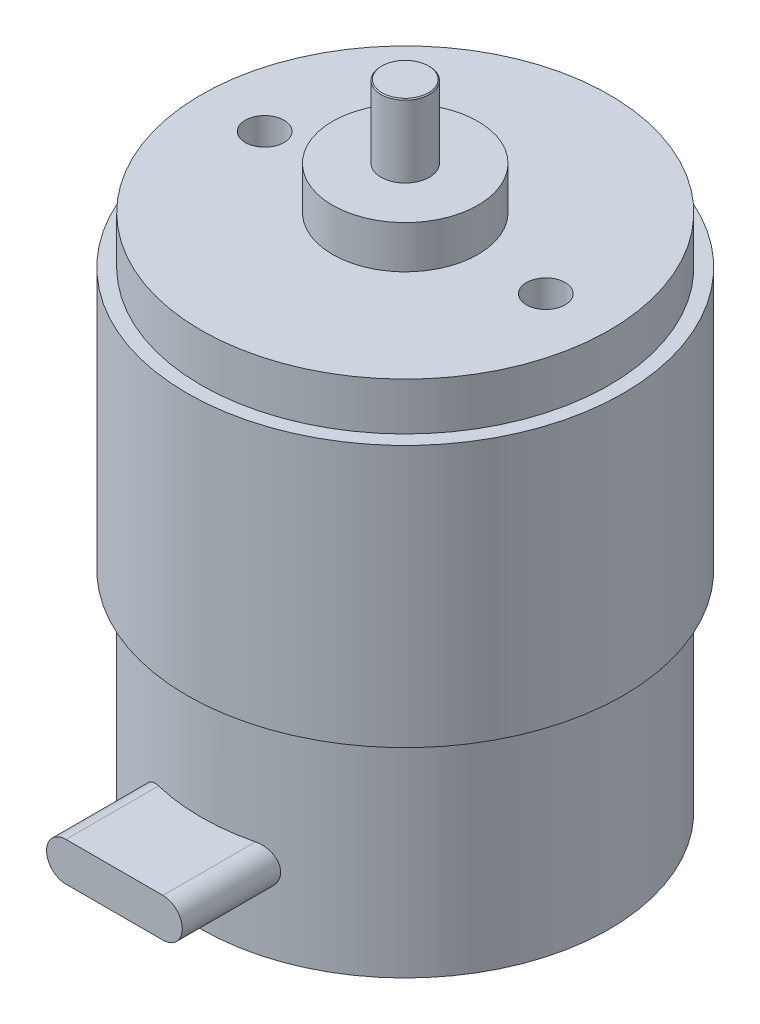
ISO-10303-21;
HEADER;
FILE_DESCRIPTION(('STEP AP214'),'2;1');
FILE_NAME('part.step','',(''),(''),'','','');
FILE_SCHEMA(('AUTOMOTIVE_DESIGN { 1 0 10303 214 1 1 1 1 }'));
ENDSEC;
DATA;
#1=APPLICATION_CONTEXT('core data for automotive mechanical design processes');
#2=APPLICATION_PROTOCOL_DEFINITION('international standard','automotive_design',2000,#1);
#3=PRODUCT_CONTEXT('',#1,'mechanical');
#4=PRODUCT('Part','Part','',(#3));
#5=PRODUCT_RELATED_PRODUCT_CATEGORY('part','',(#4));
#6=PRODUCT_DEFINITION_FORMATION('','',#4);
#7=PRODUCT_DEFINITION_CONTEXT('part definition',#1,'design');
#8=PRODUCT_DEFINITION('design','',#6,#7);
#9=PRODUCT_DEFINITION_SHAPE('','',#8);
#10=(LENGTH_UNIT() NAMED_UNIT(*) SI_UNIT(.MILLI.,.METRE.));
#11=(NAMED_UNIT(*) PLANE_ANGLE_UNIT() SI_UNIT($,.RADIAN.));
#12=(NAMED_UNIT(*) SI_UNIT($,.STERADIAN.) SOLID_ANGLE_UNIT());
#13=UNCERTAINTY_MEASURE_WITH_UNIT(LENGTH_MEASURE(1.E-05),#10,'distance_accuracy_value','');
#14=(GEOMETRIC_REPRESENTATION_CONTEXT(3) GLOBAL_UNCERTAINTY_ASSIGNED_CONTEXT((#13)) GLOBAL_UNIT_ASSIGNED_CONTEXT((#10,
#11,#12)) REPRESENTATION_CONTEXT('',''));
#15=CARTESIAN_POINT('',(0.,0.,0.));
#16=DIRECTION('',(0.,0.,1.));
#17=DIRECTION('',(1.,0.,0.));
#18=AXIS2_PLACEMENT_3D('',#15,#16,#17);
#19=CARTESIAN_POINT('',(0.,57.8,0.));
#20=DIRECTION('',(0.,-1.,0.));
#21=DIRECTION('',(0.,0.,-1.));
#22=AXIS2_PLACEMENT_3D('',#19,#20,#21);
#23=CYLINDRICAL_SURFACE('',#22,21.05);
#24=CARTESIAN_POINT('',(0.,25.9,0.));
#25=DIRECTION('',(0.,1.,0.));
#26=DIRECTION('',(0.,0.,1.));
#27=AXIS2_PLACEMENT_3D('',#24,#25,#26);
#28=CIRCLE('',#27,21.05);
#29=CARTESIAN_POINT('',(0.,25.9,21.05));
#30=VERTEX_POINT('',#29);
#31=EDGE_CURVE('E138',#30,#30,#28,.T.);
#32=ORIENTED_EDGE('',*,*,#31,.F.);
#33=EDGE_LOOP('',(#32));
#34=FACE_BOUND('',#33,.T.);
#35=CARTESIAN_POINT('',(0.,4.3,0.));
#36=DIRECTION('',(0.,1.,0.));
#37=DIRECTION('',(0.,0.,1.));
#38=AXIS2_PLACEMENT_3D('',#35,#36,#37);
#39=CIRCLE('',#38,21.05);
#40=CARTESIAN_POINT('',(0.,4.3,21.05));
#41=VERTEX_POINT('',#40);
#42=EDGE_CURVE('E125',#41,#41,#39,.T.);
#43=ORIENTED_EDGE('',*,*,#42,.T.);
#44=EDGE_LOOP('',(#43));
#45=FACE_BOUND('',#44,.T.);
#46=CARTESIAN_POINT('',(-7.,12.3,19.8520150110763));
#47=CARTESIAN_POINT('',(-6.99999458740722,12.1919907328869,19.8520177212447));
#48=CARTESIAN_POINT('',(-6.99121278584679,12.0839058525315,19.8551202290441));
#49=CARTESIAN_POINT('',(-6.95639774985022,11.8708259013393,19.8673439481557));
#50=CARTESIAN_POINT('',(-6.93034452504061,11.7658345582844,19.8764721336847));
#51=CARTESIAN_POINT('',(-6.86201484465957,11.5621550404507,19.9001645147042));
#52=CARTESIAN_POINT('',(-6.81976886088892,11.4634554302279,19.9147184984386));
#53=CARTESIAN_POINT('',(-6.72050187146198,11.2746951825582,19.9484357733604));
#54=CARTESIAN_POINT('',(-6.66348208410157,11.1846338336108,19.9675986844714));
#55=CARTESIAN_POINT('',(-6.53460276230515,11.0128128894359,20.0101521180577));
#56=CARTESIAN_POINT('',(-6.46236912491593,10.9313601377524,20.0336468816873));
#57=CARTESIAN_POINT('',(-6.30618309033368,10.7815793095357,20.0833579208581));
#58=CARTESIAN_POINT('',(-6.22222773333387,10.7132545582903,20.1095748833416));
#59=CARTESIAN_POINT('',(-6.04028832514777,10.5881017346661,20.1649917831418));
#60=CARTESIAN_POINT('',(-5.94180988005296,10.5320286621991,20.1942755040172));
#61=CARTESIAN_POINT('',(-5.73695639275948,10.4373042085942,20.2534242865081));
#62=CARTESIAN_POINT('',(-5.63057987302569,10.3986560968498,20.2832894561235));
#63=CARTESIAN_POINT('',(-5.40963160151527,10.3389651179522,20.3433488469252));
#64=CARTESIAN_POINT('',(-5.29491359897331,10.3184471248896,20.3735287565104));
#65=CARTESIAN_POINT('',(-5.0632572428235,10.2976209419156,20.432332303052));
#66=CARTESIAN_POINT('',(-4.94631891147026,10.297312549548,20.4609559555959));
#67=CARTESIAN_POINT('',(-4.71424469821783,10.3171155515014,20.5156655639204));
#68=CARTESIAN_POINT('',(-4.59910247310299,10.3371159283911,20.5417644714698));
#69=CARTESIAN_POINT('',(-4.37347049514689,10.3970861337864,20.5909832404264));
#70=CARTESIAN_POINT('',(-4.26298011512261,10.4370532608746,20.6141035042994));
#71=CARTESIAN_POINT('',(-4.05281498277954,10.5347981412374,20.6564375418517));
#72=CARTESIAN_POINT('',(-3.95293982410393,10.592109109256,20.6757340463452));
#73=CARTESIAN_POINT('',(-3.76411357706212,10.7233582256204,20.710943602515));
#74=CARTESIAN_POINT('',(-3.67516103074906,10.7972941511339,20.726857105961));
#75=CARTESIAN_POINT('',(-3.51300272184728,10.9577833153158,20.7549498073808));
#76=CARTESIAN_POINT('',(-3.43947438845406,11.0439969226404,20.7672083982979));
#77=CARTESIAN_POINT('',(-3.30787625785314,11.2278552765582,20.7885765091082));
#78=CARTESIAN_POINT('',(-3.24980526432342,11.3254991376633,20.7976862727215));
#79=CARTESIAN_POINT('',(-3.1516120824661,11.5280172105594,20.8127914470683));
#80=CARTESIAN_POINT('',(-3.11125923923933,11.6327766612723,20.8188270538593));
#81=CARTESIAN_POINT('',(-3.04860765544321,11.8476798007039,20.8280940791415));
#82=CARTESIAN_POINT('',(-3.02630831712851,11.9578233110302,20.8313255904755));
#83=CARTESIAN_POINT('',(-3.00051106814381,12.1797524979786,20.8350571187568));
#84=CARTESIAN_POINT('',(-2.99691594866212,12.2915266503951,20.8355712585399));
#85=CARTESIAN_POINT('',(-3.00837255069223,12.5140944249423,20.8339200997523));
#86=CARTESIAN_POINT('',(-3.02342402903209,12.624888059841,20.8317548361239));
#87=CARTESIAN_POINT('',(-3.07169374525748,12.8422306267945,20.8246917157905));
#88=CARTESIAN_POINT('',(-3.10489292003565,12.9487838873351,20.8197967263962));
#89=CARTESIAN_POINT('',(-3.18844192353917,13.154756407484,20.8071649278569));
#90=CARTESIAN_POINT('',(-3.23879164195814,13.2541757129703,20.7994281369894));
#91=CARTESIAN_POINT('',(-3.3552201672281,13.4432618856871,20.7809639754251));
#92=CARTESIAN_POINT('',(-3.42132610098154,13.5329115406292,20.7702314415533));
#93=CARTESIAN_POINT('',(-3.56721608206618,13.6997908384376,20.7456724769296));
#94=CARTESIAN_POINT('',(-3.64700028942627,13.7770203359737,20.7318460099795));
#95=CARTESIAN_POINT('',(-3.81841123420319,13.9174685996667,20.7009626191932));
#96=CARTESIAN_POINT('',(-3.91011192362275,13.9805925515289,20.6838851837346));
#97=CARTESIAN_POINT('',(-4.10221024774402,14.090594111553,20.6466446147876));
#98=CARTESIAN_POINT('',(-4.20260839533094,14.1374707608027,20.6264812992725));
#99=CARTESIAN_POINT('',(-4.4107808777925,14.2145038527736,20.5829778996621));
#100=CARTESIAN_POINT('',(-4.51864431583639,14.2443945571535,20.5595940797648));
#101=CARTESIAN_POINT('',(-4.73728285009642,14.2857906317402,20.510319632099));
#102=CARTESIAN_POINT('',(-4.84805831842685,14.2972936405497,20.4844286828108));
#103=CARTESIAN_POINT('',(-5.07223167907004,14.3019129797533,20.4300901808977));
#104=CARTESIAN_POINT('',(-5.18562754812686,14.2945734246514,20.4015956341564));
#105=CARTESIAN_POINT('',(-5.4092703561476,14.2609412681865,20.3434425717603));
#106=CARTESIAN_POINT('',(-5.51951679174363,14.2346456545381,20.3137838718196));
#107=CARTESIAN_POINT('',(-5.736499222247,14.1630419019824,20.2535935446595));
#108=CARTESIAN_POINT('',(-5.84309137726478,14.1173005484936,20.2230578103611));
#109=CARTESIAN_POINT('',(-6.04702161801546,14.0079615503035,20.1630191588543));
#110=CARTESIAN_POINT('',(-6.14435915708079,13.9443628516499,20.1335163027226));
#111=CARTESIAN_POINT('',(-6.32718945268471,13.8007043228696,20.0768116662611));
#112=CARTESIAN_POINT('',(-6.41265536845018,13.7206081759781,20.0496151527246));
#113=CARTESIAN_POINT('',(-6.56879789461983,13.5460257394711,19.9990036896438));
#114=CARTESIAN_POINT('',(-6.63947350732978,13.4515384798314,19.9755889952301));
#115=CARTESIAN_POINT('',(-6.76148165429124,13.2540536691967,19.9346152675769));
#116=CARTESIAN_POINT('',(-6.81336951746675,13.151433827404,19.9168902663545));
#117=CARTESIAN_POINT('',(-6.89892043382572,12.9381645879723,19.8874198545959));
#118=CARTESIAN_POINT('',(-6.93261324368046,12.8275286383053,19.8756646827311));
#119=CARTESIAN_POINT('',(-6.9709579638666,12.6466628353925,19.8622370389649));
#120=CARTESIAN_POINT('',(-6.9818297273083,12.577847891094,19.8584141596332));
#121=CARTESIAN_POINT('',(-6.99635236484358,12.4393657733328,19.8533023157847));
#122=CARTESIAN_POINT('',(-7.00000349275864,12.3696986299134,19.8520132621984));
#123=CARTESIAN_POINT('',(-7.,12.3,19.8520150110763));
#124=B_SPLINE_CURVE_WITH_KNOTS('',3,(#46,#47,#48,#49,#50,#51,#52,#53,#54,#55,#56,#57,#58,#59,
#60,#61,#62,#63,#64,#65,#66,#67,#68,#69,#70,#71,#72,#73,#74,#75,#76,#77,#78,#79,#80,#81,#82,#83,
#84,#85,#86,#87,#88,#89,#90,#91,#92,#93,#94,#95,#96,#97,#98,#99,#100,#101,#102,#103,#104,#105,
#106,#107,#108,#109,#110,#111,#112,#113,#114,#115,#116,#117,#118,#119,#120,#121,#122,#123),
.UNSPECIFIED.,.T.,.F.,(4,2,2,2,2,2,2,2,2,2,2,2,2,2,2,2,2,2,2,2,2,2,2,2,2,2,2,2,2,2,2,2,2,2,2,2,
2,2,4),(0.,0.323764536264168,0.647904461417779,0.971437385865336,1.29494363922239,
1.62759967888818,1.96033986869083,2.30988655661203,2.6594988016731,3.0189289596355,
3.37835551688897,3.73582779858486,4.09325172887544,4.44180251087894,4.79030671774284,
5.13057144167921,5.47080982313888,5.80647721673889,6.14213349605224,6.47604356083769,
6.80994927111818,7.14350490487384,7.47705839335529,7.81119035048683,8.14532621706029,
8.48164468235117,8.81798299370817,9.1594477483614,9.50095635131267,9.85080501150902,
10.2007092780074,10.5588548377817,10.9170215399877,11.2759852870953,11.6349732406512,
11.9822617003633,12.328980461957,12.5379138107405,12.7468398149188),.UNSPECIFIED.);
#125=CARTESIAN_POINT('',(-5.,14.3,20.4475548660469));
#126=VERTEX_POINT('',#125);
#127=CARTESIAN_POINT('',(-5.,10.3,20.4475548660469));
#128=VERTEX_POINT('',#127);
#129=EDGE_CURVE('E11',#126,#128,#124,.T.);
#130=ORIENTED_EDGE('',*,*,#129,.F.);
#131=CARTESIAN_POINT('',(0.,14.3,0.));
#132=DIRECTION('',(0.,-1.,0.));
#133=DIRECTION('',(0.,0.,-1.));
#134=AXIS2_PLACEMENT_3D('',#131,#132,#133);
#135=CIRCLE('',#134,21.05);
#136=CARTESIAN_POINT('',(5.,14.3,20.4475548660469));
#137=VERTEX_POINT('',#136);
#138=EDGE_CURVE('E160',#137,#126,#135,.T.);
#139=ORIENTED_EDGE('',*,*,#138,.F.);
#140=CARTESIAN_POINT('',(3.,12.3,20.8351265894882));
#141=CARTESIAN_POINT('',(3.00000487464043,12.1886690639383,20.8351266710625));
#142=CARTESIAN_POINT('',(3.0093279873551,12.0772630600193,20.8337900726467));
#143=CARTESIAN_POINT('',(3.04637186078782,11.8575329442028,20.8284050139589));
#144=CARTESIAN_POINT('',(3.07411317680268,11.7492124168159,20.8243535237348));
#145=CARTESIAN_POINT('',(3.14714848005361,11.5388666467158,20.8134406470107));
#146=CARTESIAN_POINT('',(3.19243299832294,11.4368380423075,20.8065807762247));
#147=CARTESIAN_POINT('',(3.29917125660406,11.2419229575568,20.7899223725633));
#148=CARTESIAN_POINT('',(3.36062118407493,11.1490343286795,20.780124532519));
#149=CARTESIAN_POINT('',(3.49799810482074,10.9747331915955,20.7574408921113));
#150=CARTESIAN_POINT('',(3.57395922676533,10.8933485406367,20.7445477933278));
#151=CARTESIAN_POINT('',(3.7379687494048,10.7445122332395,20.7156223617089));
#152=CARTESIAN_POINT('',(3.82601785867696,10.6770613941585,20.6995898448226));
#153=CARTESIAN_POINT('',(4.01243060527973,10.5572743381062,20.6642678833178));
#154=CARTESIAN_POINT('',(4.11088096176998,10.5050815280538,20.6449500778314));
#155=CARTESIAN_POINT('',(4.31452569127696,10.4178740348447,20.6033531931226));
#156=CARTESIAN_POINT('',(4.41972061587774,10.3828607586954,20.5810738715412));
#157=CARTESIAN_POINT('',(4.63589754974514,10.3302192237535,20.5334707997944));
#158=CARTESIAN_POINT('',(4.74695115838219,10.3129299974961,20.5080977101211));
#159=CARTESIAN_POINT('',(4.96988065758192,10.2971056190543,20.4552173347079));
#160=CARTESIAN_POINT('',(5.0817566627455,10.2985731321037,20.4277097462188));
#161=CARTESIAN_POINT('',(5.30623801323099,10.3202877846665,20.3705693257632));
#162=CARTESIAN_POINT('',(5.41878711430894,10.3410206517389,20.3408998903947));
#163=CARTESIAN_POINT('',(5.63861049628856,10.4012714414099,20.2810640956737));
#164=CARTESIAN_POINT('',(5.74588396065884,10.4407922618615,20.2508976603571));
#165=CARTESIAN_POINT('',(5.95423343174509,10.538488841956,20.1906312082022));
#166=CARTESIAN_POINT('',(6.05515617590388,10.5969993893731,20.1605429656359));
#167=CARTESIAN_POINT('',(6.24569623602726,10.7309862190804,20.1023311238028));
#168=CARTESIAN_POINT('',(6.33531332549699,10.8064628411807,20.0742075639011));
#169=CARTESIAN_POINT('',(6.4997077846176,10.9717192049707,20.0215806623204));
#170=CARTESIAN_POINT('',(6.57461777461491,11.0613565774845,19.997045529922));
#171=CARTESIAN_POINT('',(6.70810764703968,11.2530988895776,19.9526629217841));
#172=CARTESIAN_POINT('',(6.76669212998493,11.3552003051106,19.9328141256791));
#173=CARTESIAN_POINT('',(6.86315991916107,11.5642640201775,19.8997998607963));
#174=CARTESIAN_POINT('',(6.90183318728231,11.6708213904202,19.8863811254138));
#175=CARTESIAN_POINT('',(6.9606879024199,11.8895003707626,19.8658579195518));
#176=CARTESIAN_POINT('',(6.98087604879386,12.0016199494704,19.8587511615204));
#177=CARTESIAN_POINT('',(7.00140260692352,12.2222310964672,19.851523129391));
#178=CARTESIAN_POINT('',(7.00267891499864,12.3306255122503,19.8510717978602));
#179=CARTESIAN_POINT('',(6.98774162329109,12.5460402218036,19.8563347305512));
#180=CARTESIAN_POINT('',(6.97153005565029,12.6530606737704,19.862048278396));
#181=CARTESIAN_POINT('',(6.92263594879835,12.8609819168792,19.8791413311265));
#182=CARTESIAN_POINT('',(6.89021713063559,12.9619525904923,19.8904300828742));
#183=CARTESIAN_POINT('',(6.81018259904333,13.1569423504352,19.9179741461397));
#184=CARTESIAN_POINT('',(6.76256510655171,13.2509606213723,19.9342300390705));
#185=CARTESIAN_POINT('',(6.652026500425,13.4324437468915,19.9713927999275));
#186=CARTESIAN_POINT('',(6.58869459655579,13.5196327075642,19.9924229531909));
#187=CARTESIAN_POINT('',(6.44941046846463,13.6822738275325,20.0377883416951));
#188=CARTESIAN_POINT('',(6.37345520646505,13.7577231532334,20.0621243722285));
#189=CARTESIAN_POINT('',(6.20681143528395,13.8987868046329,20.1143228128624));
#190=CARTESIAN_POINT('',(6.11556971019452,13.9637048555831,20.1423016775284));
#191=CARTESIAN_POINT('',(5.92385165268387,14.0773357584262,20.1995169880506));
#192=CARTESIAN_POINT('',(5.8233733144413,14.1260450797738,20.2287537063254));
#193=CARTESIAN_POINT('',(5.61187163203816,14.2075977581526,20.288467175143));
#194=CARTESIAN_POINT('',(5.50059470329945,14.2397812236645,20.3189494865766));
#195=CARTESIAN_POINT('',(5.27390593817923,14.2845211037051,20.3789636776966));
#196=CARTESIAN_POINT('',(5.1584938738254,14.2970764344155,20.4084955048114));
#197=CARTESIAN_POINT('',(4.92627217035169,14.3020253307042,20.4657934069464));
#198=CARTESIAN_POINT('',(4.80945870232305,14.2943342330689,20.4935515684789));
#199=CARTESIAN_POINT('',(4.57837803303966,14.2585452412746,20.5464109245676));
#200=CARTESIAN_POINT('',(4.46411055062329,14.2304496120837,20.5715124136687));
#201=CARTESIAN_POINT('',(4.24405636408111,14.1552040314264,20.6180230805467));
#202=CARTESIAN_POINT('',(4.13814088631952,14.1084725440395,20.6394994981659));
#203=CARTESIAN_POINT('',(3.93549236812381,13.9971103124678,20.6790973569974));
#204=CARTESIAN_POINT('',(3.8387576744026,13.9324827992653,20.6972194028301));
#205=CARTESIAN_POINT('',(3.65993985873888,13.7889743466049,20.72957796124));
#206=CARTESIAN_POINT('',(3.57754373342108,13.7105030423572,20.7439024695082));
#207=CARTESIAN_POINT('',(3.42701676610904,13.540410422449,20.7693018420908));
#208=CARTESIAN_POINT('',(3.35888790770219,13.4487872812606,20.780376254628));
#209=CARTESIAN_POINT('',(3.24005884981857,13.2566437876889,20.7992329574974));
#210=CARTESIAN_POINT('',(3.18909400895441,13.1562917535877,20.8070657079218));
#211=CARTESIAN_POINT('',(3.10470214333042,12.9483853183305,20.8198262017372));
#212=CARTESIAN_POINT('',(3.07125452759334,12.8408395417393,20.824757356714));
#213=CARTESIAN_POINT('',(3.03142941825745,12.6605441109147,20.8305825361783));
#214=CARTESIAN_POINT('',(3.01965973036164,12.5889647594777,20.8322878960173));
#215=CARTESIAN_POINT('',(3.00394344784383,12.4449342098966,20.8345598941596));
#216=CARTESIAN_POINT('',(2.99999682632117,12.3724830147512,20.8351265363786));
#217=CARTESIAN_POINT('',(3.,12.3,20.8351265894882));
#218=B_SPLINE_CURVE_WITH_KNOTS('',3,(#140,#141,#142,#143,#144,#145,#146,#147,#148,#149,#150,
#151,#152,#153,#154,#155,#156,#157,#158,#159,#160,#161,#162,#163,#164,#165,#166,#167,#168,#169,
#170,#171,#172,#173,#174,#175,#176,#177,#178,#179,#180,#181,#182,#183,#184,#185,#186,#187,#188,
#189,#190,#191,#192,#193,#194,#195,#196,#197,#198,#199,#200,#201,#202,#203,#204,#205,#206,#207,
#208,#209,#210,#211,#212,#213,#214,#215,#216,#217),.UNSPECIFIED.,.T.,.F.,(4,2,2,2,2,2,2,2,2,2,2,
2,2,2,2,2,2,2,2,2,2,2,2,2,2,2,2,2,2,2,2,2,2,2,2,2,2,2,4),(0.,0.333728225853083,
0.667829530434417,1.00175075407964,1.33559329436264,1.67023088191007,2.00488809372661,
2.34259638387025,2.68033232777771,3.02441444074544,3.36854544651192,3.72159532674371,
4.07469967904803,4.43440215841308,4.79411184283,5.15041165117607,5.5066109526881,
5.84730834352352,6.18788221025437,6.51150605670392,6.83509230117472,7.15357669334513,
7.47209837899448,7.80003615365578,8.1280529602476,8.47276953718309,8.81756115035364,
9.17521918860568,9.53289697517553,9.89207281389487,10.2512087890447,10.6026976452351,
10.9541230842903,11.2965041675753,11.6389328207684,11.9758101510243,12.3122905981446,
12.5295681308127,12.7468449163416),.UNSPECIFIED.);
#219=CARTESIAN_POINT('',(5.00000000000076,10.2999999999946,20.4475548660473));
#220=VERTEX_POINT('',#219);
#221=EDGE_CURVE('E55',#220,#137,#218,.T.);
#222=ORIENTED_EDGE('',*,*,#221,.F.);
#223=CARTESIAN_POINT('',(0.,10.3,0.));
#224=DIRECTION('',(0.,1.,0.));
#225=DIRECTION('',(0.,0.,1.));
#226=AXIS2_PLACEMENT_3D('',#223,#224,#225);
#227=CIRCLE('',#226,21.05);
#228=EDGE_CURVE('E45',#128,#220,#227,.T.);
#229=ORIENTED_EDGE('',*,*,#228,.F.);
#230=EDGE_LOOP('',(#130,#139,#222,#229));
#231=FACE_BOUND('',#230,.T.);
#232=ADVANCED_FACE('F32',(#34,#45,#231),#23,.T.);
#233=CARTESIAN_POINT('',(0.,4.3,0.));
#234=DIRECTION('',(0.,-1.,0.));
#235=DIRECTION('',(0.,0.,-1.));
#236=AXIS2_PLACEMENT_3D('',#233,#234,#235);
#237=CYLINDRICAL_SURFACE('',#236,7.5);
#238=CARTESIAN_POINT('',(0.,4.3,0.));
#239=DIRECTION('',(0.,1.,0.));
#240=DIRECTION('',(0.,0.,1.));
#241=AXIS2_PLACEMENT_3D('',#238,#239,#240);
#242=CIRCLE('',#241,7.5);
#243=CARTESIAN_POINT('',(0.,4.3,-7.5));
#244=VERTEX_POINT('',#243);
#245=EDGE_CURVE('E135',#244,#244,#242,.T.);
#246=CARTESIAN_POINT('',(0.,0.,0.));
#247=DIRECTION('',(0.,1.,0.));
#248=DIRECTION('',(0.,0.,1.));
#249=AXIS2_PLACEMENT_3D('',#246,#247,#248);
#250=CIRCLE('',#249,7.5);
#251=CARTESIAN_POINT('',(0.,0.,-7.5));
#252=VERTEX_POINT('',#251);
#253=EDGE_CURVE('E132',#252,#252,#250,.T.);
#254=CARTESIAN_POINT('',(0.,4.3,-7.5));
#255=CARTESIAN_POINT('',(0.,4.25520833333333,-7.5));
#256=CARTESIAN_POINT('',(0.,4.21041666666667,-7.5));
#257=CARTESIAN_POINT('',(0.,4.12083333333333,-7.5));
#258=CARTESIAN_POINT('',(0.,4.07604166666667,-7.5));
#259=CARTESIAN_POINT('',(0.,3.98645833333333,-7.5));
#260=CARTESIAN_POINT('',(0.,3.94166666666667,-7.5));
#261=CARTESIAN_POINT('',(0.,3.85208333333333,-7.5));
#262=CARTESIAN_POINT('',(0.,3.80729166666667,-7.5));
#263=CARTESIAN_POINT('',(0.,3.71770833333333,-7.5));
#264=CARTESIAN_POINT('',(0.,3.67291666666667,-7.5));
#265=CARTESIAN_POINT('',(0.,3.58333333333333,-7.5));
#266=CARTESIAN_POINT('',(0.,3.53854166666667,-7.5));
#267=CARTESIAN_POINT('',(0.,3.44895833333333,-7.5));
#268=CARTESIAN_POINT('',(0.,3.40416666666667,-7.5));
#269=CARTESIAN_POINT('',(0.,3.31458333333333,-7.5));
#270=CARTESIAN_POINT('',(0.,3.26979166666667,-7.5));
#271=CARTESIAN_POINT('',(0.,3.18020833333333,-7.5));
#272=CARTESIAN_POINT('',(0.,3.13541666666667,-7.5));
#273=CARTESIAN_POINT('',(0.,3.04583333333333,-7.5));
#274=CARTESIAN_POINT('',(0.,3.00104166666667,-7.5));
#275=CARTESIAN_POINT('',(0.,2.91145833333333,-7.5));
#276=CARTESIAN_POINT('',(0.,2.86666666666667,-7.5));
#277=CARTESIAN_POINT('',(0.,2.77708333333333,-7.5));
#278=CARTESIAN_POINT('',(0.,2.73229166666667,-7.5));
#279=CARTESIAN_POINT('',(0.,2.64270833333333,-7.5));
#280=CARTESIAN_POINT('',(0.,2.59791666666667,-7.5));
#281=CARTESIAN_POINT('',(0.,2.50833333333333,-7.5));
#282=CARTESIAN_POINT('',(0.,2.46354166666667,-7.5));
#283=CARTESIAN_POINT('',(0.,2.37395833333333,-7.5));
#284=CARTESIAN_POINT('',(0.,2.32916666666667,-7.5));
#285=CARTESIAN_POINT('',(0.,2.23958333333333,-7.5));
#286=CARTESIAN_POINT('',(0.,2.19479166666667,-7.5));
#287=CARTESIAN_POINT('',(0.,2.10520833333333,-7.5));
#288=CARTESIAN_POINT('',(0.,2.06041666666667,-7.5));
#289=CARTESIAN_POINT('',(0.,1.97083333333333,-7.5));
#290=CARTESIAN_POINT('',(0.,1.92604166666667,-7.5));
#291=CARTESIAN_POINT('',(0.,1.83645833333333,-7.5));
#292=CARTESIAN_POINT('',(0.,1.79166666666667,-7.5));
#293=CARTESIAN_POINT('',(0.,1.70208333333333,-7.5));
#294=CARTESIAN_POINT('',(0.,1.65729166666667,-7.5));
#295=CARTESIAN_POINT('',(0.,1.56770833333333,-7.5));
#296=CARTESIAN_POINT('',(0.,1.52291666666667,-7.5));
#297=CARTESIAN_POINT('',(0.,1.43333333333333,-7.5));
#298=CARTESIAN_POINT('',(0.,1.38854166666667,-7.5));
#299=CARTESIAN_POINT('',(0.,1.29895833333333,-7.5));
#300=CARTESIAN_POINT('',(0.,1.25416666666667,-7.5));
#301=CARTESIAN_POINT('',(0.,1.16458333333333,-7.5));
#302=CARTESIAN_POINT('',(0.,1.11979166666667,-7.5));
#303=CARTESIAN_POINT('',(0.,1.03020833333333,-7.5));
#304=CARTESIAN_POINT('',(0.,0.985416666666665,-7.5));
#305=CARTESIAN_POINT('',(0.,0.895833333333332,-7.5));
#306=CARTESIAN_POINT('',(0.,0.851041666666665,-7.5));
#307=CARTESIAN_POINT('',(0.,0.761458333333332,-7.5));
#308=CARTESIAN_POINT('',(0.,0.716666666666665,-7.5));
#309=CARTESIAN_POINT('',(0.,0.627083333333332,-7.5));
#310=CARTESIAN_POINT('',(0.,0.582291666666665,-7.5));
#311=CARTESIAN_POINT('',(0.,0.492708333333332,-7.5));
#312=CARTESIAN_POINT('',(0.,0.447916666666665,-7.5));
#313=CARTESIAN_POINT('',(0.,0.358333333333332,-7.5));
#314=CARTESIAN_POINT('',(0.,0.313541666666666,-7.5));
#315=CARTESIAN_POINT('',(0.,0.223958333333332,-7.5));
#316=CARTESIAN_POINT('',(0.,0.179166666666666,-7.5));
#317=CARTESIAN_POINT('',(0.,0.0895833333333324,-7.5));
#318=CARTESIAN_POINT('',(0.,0.0447916666666658,-7.5));
#319=CARTESIAN_POINT('',(0.,0.,-7.5));
#320=B_SPLINE_CURVE_WITH_KNOTS('',3,(#254,#255,#256,#257,#258,#259,#260,#261,#262,#263,#264,
#265,#266,#267,#268,#269,#270,#271,#272,#273,#274,#275,#276,#277,#278,#279,#280,#281,#282,#283,
#284,#285,#286,#287,#288,#289,#290,#291,#292,#293,#294,#295,#296,#297,#298,#299,#300,#301,#302,
#303,#304,#305,#306,#307,#308,#309,#310,#311,#312,#313,#314,#315,#316,#317,#318,#319),
.UNSPECIFIED.,.F.,.F.,(4,2,2,2,2,2,2,2,2,2,2,2,2,2,2,2,2,2,2,2,2,2,2,2,2,2,2,2,2,2,2,2,4),(0.,
0.134375000000001,0.268750000000001,0.403125000000001,0.537500000000001,0.671875000000001,
0.806250000000001,0.940625,1.075,1.209375,1.34375,1.478125,1.6125,1.746875,1.88125,2.015625,
2.15,2.284375,2.41875,2.553125,2.6875,2.821875,2.95625,3.090625,3.225,3.359375,3.49375,3.628125,
3.7625,3.896875,4.03125,4.165625,4.3),.UNSPECIFIED.);
#321=EDGE_CURVE('BSEAM243',#244,#252,#320,.T.);
#322=ORIENTED_EDGE('',*,*,#245,.F.);
#323=ORIENTED_EDGE('',*,*,#253,.T.);
#324=ORIENTED_EDGE('',*,*,#321,.T.);
#325=ORIENTED_EDGE('',*,*,#321,.F.);
#326=EDGE_LOOP('',(#322,#324,#323,#325));
#327=FACE_BOUND('',#326,.T.);
#328=ADVANCED_FACE('F243',(#327),#237,.T.);
#329=CARTESIAN_POINT('',(0.,0.,0.));
#330=DIRECTION('',(0.,1.,0.));
#331=DIRECTION('',(0.,0.,1.));
#332=AXIS2_PLACEMENT_3D('',#329,#330,#331);
#333=PLANE('',#332);
#334=CARTESIAN_POINT('',(0.,0.,0.));
#335=DIRECTION('',(0.,1.,0.));
#336=DIRECTION('',(0.,0.,1.));
#337=AXIS2_PLACEMENT_3D('',#334,#335,#336);
#338=CIRCLE('',#337,2.5);
#339=CARTESIAN_POINT('',(0.,0.,2.5));
#340=VERTEX_POINT('',#339);
#341=EDGE_CURVE('E110',#340,#340,#338,.T.);
#342=ORIENTED_EDGE('',*,*,#341,.T.);
#343=EDGE_LOOP('',(#342));
#344=FACE_BOUND('',#343,.T.);
#345=ORIENTED_EDGE('',*,*,#253,.F.);
#346=EDGE_LOOP('',(#345));
#347=FACE_BOUND('',#346,.T.);
#348=ADVANCED_FACE('F238',(#344,#347),#333,.F.);
#349=CARTESIAN_POINT('',(0.,4.3,0.));
#350=DIRECTION('',(0.,1.,0.));
#351=DIRECTION('',(0.,0.,1.));
#352=AXIS2_PLACEMENT_3D('',#349,#350,#351);
#353=PLANE('',#352);
#354=ORIENTED_EDGE('',*,*,#245,.T.);
#355=EDGE_LOOP('',(#354));
#356=FACE_BOUND('',#355,.T.);
#357=ORIENTED_EDGE('',*,*,#42,.F.);
#358=EDGE_LOOP('',(#357));
#359=FACE_BOUND('',#358,.T.);
#360=ADVANCED_FACE('F225',(#356,#359),#353,.F.);
#361=CARTESIAN_POINT('',(0.,25.9,0.));
#362=DIRECTION('',(0.,1.,0.));
#363=DIRECTION('',(0.,0.,1.));
#364=AXIS2_PLACEMENT_3D('',#361,#362,#363);
#365=CYLINDRICAL_SURFACE('',#364,22.5);
#366=CARTESIAN_POINT('',(0.,25.9,0.));
#367=DIRECTION('',(0.,1.,0.));
#368=DIRECTION('',(0.,0.,1.));
#369=AXIS2_PLACEMENT_3D('',#366,#367,#368);
#370=CIRCLE('',#369,22.5);
#371=CARTESIAN_POINT('',(0.,25.9,22.5));
#372=VERTEX_POINT('',#371);
#373=EDGE_CURVE('E116',#372,#372,#370,.T.);
#374=ORIENTED_EDGE('',*,*,#373,.T.);
#375=EDGE_LOOP('',(#374));
#376=FACE_BOUND('',#375,.T.);
#377=CARTESIAN_POINT('',(0.,52.9,0.));
#378=DIRECTION('',(0.,1.,0.));
#379=DIRECTION('',(0.,0.,1.));
#380=AXIS2_PLACEMENT_3D('',#377,#378,#379);
#381=CIRCLE('',#380,22.5);
#382=CARTESIAN_POINT('',(0.,52.9,22.5));
#383=VERTEX_POINT('',#382);
#384=EDGE_CURVE('E115',#383,#383,#381,.T.);
#385=ORIENTED_EDGE('',*,*,#384,.F.);
#386=EDGE_LOOP('',(#385));
#387=FACE_BOUND('',#386,.T.);
#388=ADVANCED_FACE('F217',(#376,#387),#365,.T.);
#389=CARTESIAN_POINT('',(0.,25.9,0.));
#390=DIRECTION('',(0.,1.,0.));
#391=DIRECTION('',(0.,0.,1.));
#392=AXIS2_PLACEMENT_3D('',#389,#390,#391);
#393=PLANE('',#392);
#394=ORIENTED_EDGE('',*,*,#31,.T.);
#395=EDGE_LOOP('',(#394));
#396=FACE_BOUND('',#395,.T.);
#397=ORIENTED_EDGE('',*,*,#373,.F.);
#398=EDGE_LOOP('',(#397));
#399=FACE_BOUND('',#398,.T.);
#400=ADVANCED_FACE('F213',(#396,#399),#393,.F.);
#401=CARTESIAN_POINT('',(0.,52.9,0.));
#402=DIRECTION('',(0.,1.,0.));
#403=DIRECTION('',(0.,0.,1.));
#404=AXIS2_PLACEMENT_3D('',#401,#402,#403);
#405=PLANE('',#404);
#406=CARTESIAN_POINT('',(0.,52.9,0.));
#407=DIRECTION('',(0.,1.,0.));
#408=DIRECTION('',(0.,0.,1.));
#409=AXIS2_PLACEMENT_3D('',#406,#407,#408);
#410=CIRCLE('',#409,21.05);
#411=CARTESIAN_POINT('',(0.,52.9,21.05));
#412=VERTEX_POINT('',#411);
#413=EDGE_CURVE('E119',#412,#412,#410,.T.);
#414=ORIENTED_EDGE('',*,*,#413,.F.);
#415=EDGE_LOOP('',(#414));
#416=FACE_BOUND('',#415,.T.);
#417=ORIENTED_EDGE('',*,*,#384,.T.);
#418=EDGE_LOOP('',(#417));
#419=FACE_BOUND('',#418,.T.);
#420=ADVANCED_FACE('F216',(#416,#419),#405,.T.);
#421=CARTESIAN_POINT('',(0.,62.2,0.));
#422=DIRECTION('',(0.,1.,0.));
#423=DIRECTION('',(0.,0.,1.));
#424=AXIS2_PLACEMENT_3D('',#421,#422,#423);
#425=PLANE('',#424);
#426=CARTESIAN_POINT('',(0.,62.2,0.));
#427=DIRECTION('',(0.,1.,0.));
#428=DIRECTION('',(0.,0.,1.));
#429=AXIS2_PLACEMENT_3D('',#426,#427,#428);
#430=CIRCLE('',#429,2.5);
#431=CARTESIAN_POINT('',(0.,62.2,2.5));
#432=VERTEX_POINT('',#431);
#433=EDGE_CURVE('E145',#432,#432,#430,.T.);
#434=ORIENTED_EDGE('',*,*,#433,.F.);
#435=EDGE_LOOP('',(#434));
#436=FACE_BOUND('',#435,.T.);
#437=CARTESIAN_POINT('',(0.,62.2,0.));
#438=DIRECTION('',(0.,1.,0.));
#439=DIRECTION('',(0.,0.,1.));
#440=AXIS2_PLACEMENT_3D('',#437,#438,#439);
#441=CIRCLE('',#440,7.5);
#442=CARTESIAN_POINT('',(0.,62.2,7.5));
#443=VERTEX_POINT('',#442);
#444=EDGE_CURVE('E122',#443,#443,#441,.T.);
#445=ORIENTED_EDGE('',*,*,#444,.T.);
#446=EDGE_LOOP('',(#445));
#447=FACE_BOUND('',#446,.T.);
#448=ADVANCED_FACE('F221',(#436,#447),#425,.T.);
#449=CARTESIAN_POINT('',(0.,62.2,0.));
#450=DIRECTION('',(0.,-1.,0.));
#451=DIRECTION('',(0.,0.,-1.));
#452=AXIS2_PLACEMENT_3D('',#449,#450,#451);
#453=CYLINDRICAL_SURFACE('',#452,7.5);
#454=ORIENTED_EDGE('',*,*,#444,.F.);
#455=EDGE_LOOP('',(#454));
#456=FACE_BOUND('',#455,.T.);
#457=CARTESIAN_POINT('',(0.,57.8,0.));
#458=DIRECTION('',(0.,1.,0.));
#459=DIRECTION('',(0.,0.,1.));
#460=AXIS2_PLACEMENT_3D('',#457,#458,#459);
#461=CIRCLE('',#460,7.5);
#462=CARTESIAN_POINT('',(0.,57.8,7.5));
#463=VERTEX_POINT('',#462);
#464=EDGE_CURVE('E126',#463,#463,#461,.T.);
#465=ORIENTED_EDGE('',*,*,#464,.T.);
#466=EDGE_LOOP('',(#465));
#467=FACE_BOUND('',#466,.T.);
#468=ADVANCED_FACE('F229',(#456,#467),#453,.T.);
#469=CARTESIAN_POINT('',(0.,57.8,0.));
#470=DIRECTION('',(0.,1.,0.));
#471=DIRECTION('',(0.,0.,1.));
#472=AXIS2_PLACEMENT_3D('',#469,#470,#471);
#473=PLANE('',#472);
#474=CARTESIAN_POINT('',(-14.5,57.8,-1.01411811258142E-13));
#475=DIRECTION('',(0.,1.,0.));
#476=DIRECTION('',(0.,0.,1.));
#477=AXIS2_PLACEMENT_3D('',#474,#475,#476);
#478=CIRCLE('',#477,2.);
#479=CARTESIAN_POINT('',(-14.5,57.8,1.9999999999999));
#480=VERTEX_POINT('',#479);
#481=EDGE_CURVE('E95',#480,#480,#478,.T.);
#482=ORIENTED_EDGE('',*,*,#481,.F.);
#483=EDGE_LOOP('',(#482));
#484=FACE_BOUND('',#483,.T.);
#485=CARTESIAN_POINT('',(14.5,57.8,0.));
#486=DIRECTION('',(0.,1.,0.));
#487=DIRECTION('',(0.,0.,1.));
#488=AXIS2_PLACEMENT_3D('',#485,#486,#487);
#489=CIRCLE('',#488,2.);
#490=CARTESIAN_POINT('',(14.5,57.8,2.));
#491=VERTEX_POINT('',#490);
#492=EDGE_CURVE('E105',#491,#491,#489,.T.);
#493=ORIENTED_EDGE('',*,*,#492,.F.);
#494=EDGE_LOOP('',(#493));
#495=FACE_BOUND('',#494,.T.);
#496=ORIENTED_EDGE('',*,*,#464,.F.);
#497=EDGE_LOOP('',(#496));
#498=FACE_BOUND('',#497,.T.);
#499=CARTESIAN_POINT('',(0.,57.8,0.));
#500=DIRECTION('',(0.,1.,0.));
#501=DIRECTION('',(0.,0.,1.));
#502=AXIS2_PLACEMENT_3D('',#499,#500,#501);
#503=CIRCLE('',#502,21.05);
#504=CARTESIAN_POINT('',(0.,57.8,21.05));
#505=VERTEX_POINT('',#504);
#506=EDGE_CURVE('E129',#505,#505,#503,.T.);
#507=ORIENTED_EDGE('',*,*,#506,.T.);
#508=EDGE_LOOP('',(#507));
#509=FACE_BOUND('',#508,.T.);
#510=ADVANCED_FACE('F233',(#484,#495,#498,#509),#473,.T.);
#511=ORIENTED_EDGE('',*,*,#413,.T.);
#512=EDGE_LOOP('',(#511));
#513=FACE_BOUND('',#512,.T.);
#514=ORIENTED_EDGE('',*,*,#506,.F.);
#515=EDGE_LOOP('',(#514));
#516=FACE_BOUND('',#515,.T.);
#517=ADVANCED_FACE('F167',(#513,#516),#23,.T.);
#518=CARTESIAN_POINT('',(0.,69.7,0.));
#519=DIRECTION('',(0.,1.,0.));
#520=DIRECTION('',(0.,0.,1.));
#521=AXIS2_PLACEMENT_3D('',#518,#519,#520);
#522=PLANE('',#521);
#523=CARTESIAN_POINT('',(0.,69.7,0.));
#524=DIRECTION('',(0.,1.,0.));
#525=DIRECTION('',(0.,0.,1.));
#526=AXIS2_PLACEMENT_3D('',#523,#524,#525);
#527=CIRCLE('',#526,2.39999999999999);
#528=CARTESIAN_POINT('',(0.,69.7,2.39999999999999));
#529=VERTEX_POINT('',#528);
#530=EDGE_CURVE('E154',#529,#529,#527,.T.);
#531=ORIENTED_EDGE('',*,*,#530,.T.);
#532=EDGE_LOOP('',(#531));
#533=FACE_BOUND('',#532,.T.);
#534=ADVANCED_FACE('F205',(#533),#522,.T.);
#535=CARTESIAN_POINT('',(0.,-0.300000000000009,0.));
#536=DIRECTION('',(0.,1.,0.));
#537=DIRECTION('',(0.,0.,1.));
#538=AXIS2_PLACEMENT_3D('',#535,#536,#537);
#539=CYLINDRICAL_SURFACE('',#538,2.5);
#540=CARTESIAN_POINT('',(0.,69.6,0.));
#541=DIRECTION('',(0.,1.,0.));
#542=DIRECTION('',(0.,0.,1.));
#543=AXIS2_PLACEMENT_3D('',#540,#541,#542);
#544=CIRCLE('',#543,2.5);
#545=CARTESIAN_POINT('',(0.,69.6,2.5));
#546=VERTEX_POINT('',#545);
#547=EDGE_CURVE('E157',#546,#546,#544,.F.);
#548=ORIENTED_EDGE('',*,*,#547,.T.);
#549=EDGE_LOOP('',(#548));
#550=FACE_BOUND('',#549,.T.);
#551=ORIENTED_EDGE('',*,*,#433,.T.);
#552=EDGE_LOOP('',(#551));
#553=FACE_BOUND('',#552,.T.);
#554=ADVANCED_FACE('F208',(#550,#553),#539,.T.);
#555=CARTESIAN_POINT('',(0.,-0.200000000000016,0.));
#556=DIRECTION('',(0.,1.,0.));
#557=DIRECTION('',(0.,0.,1.));
#558=AXIS2_PLACEMENT_3D('',#555,#556,#557);
#559=CIRCLE('',#558,2.5);
#560=CARTESIAN_POINT('',(0.,-0.200000000000016,2.5));
#561=VERTEX_POINT('',#560);
#562=EDGE_CURVE('E148',#561,#561,#559,.T.);
#563=ORIENTED_EDGE('',*,*,#562,.T.);
#564=EDGE_LOOP('',(#563));
#565=FACE_BOUND('',#564,.T.);
#566=ORIENTED_EDGE('',*,*,#341,.F.);
#567=EDGE_LOOP('',(#566));
#568=FACE_BOUND('',#567,.T.);
#569=ADVANCED_FACE('F203',(#565,#568),#539,.T.);
#570=CARTESIAN_POINT('',(0.,-0.300000000000009,0.));
#571=DIRECTION('',(0.,1.,0.));
#572=DIRECTION('',(0.,0.,1.));
#573=AXIS2_PLACEMENT_3D('',#570,#571,#572);
#574=PLANE('',#573);
#575=CARTESIAN_POINT('',(0.,-0.300000000000009,0.));
#576=DIRECTION('',(0.,1.,0.));
#577=DIRECTION('',(0.,0.,1.));
#578=AXIS2_PLACEMENT_3D('',#575,#576,#577);
#579=CIRCLE('',#578,2.40000000000001);
#580=CARTESIAN_POINT('',(0.,-0.300000000000009,2.40000000000001));
#581=VERTEX_POINT('',#580);
#582=EDGE_CURVE('E151',#581,#581,#579,.F.);
#583=ORIENTED_EDGE('',*,*,#582,.T.);
#584=EDGE_LOOP('',(#583));
#585=FACE_BOUND('',#584,.T.);
#586=ADVANCED_FACE('F199',(#585),#574,.F.);
#587=CARTESIAN_POINT('',(14.5,52.8,0.));
#588=DIRECTION('',(0.,1.,0.));
#589=DIRECTION('',(0.,0.,1.));
#590=AXIS2_PLACEMENT_3D('',#587,#588,#589);
#591=CYLINDRICAL_SURFACE('',#590,2.);
#592=CARTESIAN_POINT('',(14.5,52.8,0.));
#593=DIRECTION('',(0.,1.,0.));
#594=DIRECTION('',(0.,0.,1.));
#595=AXIS2_PLACEMENT_3D('',#592,#593,#594);
#596=CIRCLE('',#595,2.);
#597=CARTESIAN_POINT('',(14.5,52.8,2.));
#598=VERTEX_POINT('',#597);
#599=EDGE_CURVE('E107',#598,#598,#596,.T.);
#600=ORIENTED_EDGE('',*,*,#599,.F.);
#601=EDGE_LOOP('',(#600));
#602=FACE_BOUND('',#601,.T.);
#603=ORIENTED_EDGE('',*,*,#492,.T.);
#604=EDGE_LOOP('',(#603));
#605=FACE_BOUND('',#604,.T.);
#606=ADVANCED_FACE('F195',(#602,#605),#591,.F.);
#607=CARTESIAN_POINT('',(14.5,52.8,0.));
#608=DIRECTION('',(0.,1.,0.));
#609=DIRECTION('',(0.,0.,1.));
#610=AXIS2_PLACEMENT_3D('',#607,#608,#609);
#611=PLANE('',#610);
#612=ORIENTED_EDGE('',*,*,#599,.T.);
#613=EDGE_LOOP('',(#612));
#614=FACE_BOUND('',#613,.T.);
#615=ADVANCED_FACE('F191',(#614),#611,.T.);
#616=CARTESIAN_POINT('',(-14.5,52.8,-1.01411811258142E-13));
#617=DIRECTION('',(0.,1.,0.));
#618=DIRECTION('',(0.,0.,1.));
#619=AXIS2_PLACEMENT_3D('',#616,#617,#618);
#620=CYLINDRICAL_SURFACE('',#619,2.);
#621=CARTESIAN_POINT('',(-14.5,52.8,-1.01411811258142E-13));
#622=DIRECTION('',(0.,1.,0.));
#623=DIRECTION('',(0.,0.,1.));
#624=AXIS2_PLACEMENT_3D('',#621,#622,#623);
#625=CIRCLE('',#624,2.);
#626=CARTESIAN_POINT('',(-14.5,52.8,1.9999999999999));
#627=VERTEX_POINT('',#626);
#628=EDGE_CURVE('E98',#627,#627,#625,.T.);
#629=ORIENTED_EDGE('',*,*,#628,.F.);
#630=EDGE_LOOP('',(#629));
#631=FACE_BOUND('',#630,.T.);
#632=ORIENTED_EDGE('',*,*,#481,.T.);
#633=EDGE_LOOP('',(#632));
#634=FACE_BOUND('',#633,.T.);
#635=ADVANCED_FACE('F187',(#631,#634),#620,.F.);
#636=CARTESIAN_POINT('',(-14.5,52.8,-1.01411811258142E-13));
#637=DIRECTION('',(0.,1.,0.));
#638=DIRECTION('',(0.,0.,1.));
#639=AXIS2_PLACEMENT_3D('',#636,#637,#638);
#640=PLANE('',#639);
#641=ORIENTED_EDGE('',*,*,#628,.T.);
#642=EDGE_LOOP('',(#641));
#643=FACE_BOUND('',#642,.T.);
#644=ADVANCED_FACE('F183',(#643),#640,.T.);
#645=CARTESIAN_POINT('',(0.,-0.200000000000016,0.));
#646=DIRECTION('',(0.,1.,0.));
#647=DIRECTION('',(0.,0.,1.));
#648=AXIS2_PLACEMENT_3D('',#645,#646,#647);
#649=CONICAL_SURFACE('',#648,2.5,0.785398163397418);
#650=ORIENTED_EDGE('',*,*,#582,.F.);
#651=EDGE_LOOP('',(#650));
#652=FACE_BOUND('',#651,.T.);
#653=ORIENTED_EDGE('',*,*,#562,.F.);
#654=EDGE_LOOP('',(#653));
#655=FACE_BOUND('',#654,.T.);
#656=ADVANCED_FACE('F186',(#652,#655),#649,.T.);
#657=CARTESIAN_POINT('',(0.,69.7,0.));
#658=DIRECTION('',(0.,-1.,0.));
#659=DIRECTION('',(0.,0.,-1.));
#660=AXIS2_PLACEMENT_3D('',#657,#658,#659);
#661=CONICAL_SURFACE('',#660,2.39999999999999,0.785398163397507);
#662=ORIENTED_EDGE('',*,*,#547,.F.);
#663=EDGE_LOOP('',(#662));
#664=FACE_BOUND('',#663,.T.);
#665=ORIENTED_EDGE('',*,*,#530,.F.);
#666=EDGE_LOOP('',(#665));
#667=FACE_BOUND('',#666,.T.);
#668=ADVANCED_FACE('F34',(#664,#667),#661,.T.);
#669=CARTESIAN_POINT('',(-5.,12.3,30.));
#670=DIRECTION('',(0.,0.,-1.));
#671=DIRECTION('',(-1.,0.,0.));
#672=AXIS2_PLACEMENT_3D('',#669,#670,#671);
#673=CYLINDRICAL_SURFACE('',#672,2.);
#674=DIRECTION('',(0.,0.,-1.));
#675=VECTOR('',#674,1.);
#676=CARTESIAN_POINT('',(-5.,14.3,30.));
#677=LINE('',#676,#675);
#678=CARTESIAN_POINT('',(-5.,14.3,30.));
#679=VERTEX_POINT('',#678);
#680=EDGE_CURVE('E427',#679,#126,#677,.T.);
#681=ORIENTED_EDGE('',*,*,#680,.T.);
#682=ORIENTED_EDGE('',*,*,#129,.T.);
#683=DIRECTION('',(0.,0.,-1.));
#684=VECTOR('',#683,1.);
#685=CARTESIAN_POINT('',(-5.,10.3,30.));
#686=LINE('',#685,#684);
#687=CARTESIAN_POINT('',(-5.,10.3,30.));
#688=VERTEX_POINT('',#687);
#689=EDGE_CURVE('E78',#688,#128,#686,.T.);
#690=ORIENTED_EDGE('',*,*,#689,.F.);
#691=CARTESIAN_POINT('',(-5.,12.3,30.));
#692=DIRECTION('',(0.,0.,1.));
#693=DIRECTION('',(1.,0.,0.));
#694=AXIS2_PLACEMENT_3D('',#691,#692,#693);
#695=CIRCLE('',#694,2.);
#696=EDGE_CURVE('E84',#679,#688,#695,.T.);
#697=ORIENTED_EDGE('',*,*,#696,.F.);
#698=EDGE_LOOP('',(#681,#682,#690,#697));
#699=FACE_BOUND('',#698,.T.);
#700=ADVANCED_FACE('F94',(#699),#673,.T.);
#701=CARTESIAN_POINT('',(5.,12.3,30.));
#702=DIRECTION('',(0.,0.,-1.));
#703=DIRECTION('',(-1.,0.,0.));
#704=AXIS2_PLACEMENT_3D('',#701,#702,#703);
#705=CYLINDRICAL_SURFACE('',#704,2.);
#706=DIRECTION('',(0.,0.,-1.));
#707=VECTOR('',#706,1.);
#708=CARTESIAN_POINT('',(5.,10.3,30.));
#709=LINE('',#708,#707);
#710=CARTESIAN_POINT('',(5.,10.3,30.));
#711=VERTEX_POINT('',#710);
#712=EDGE_CURVE('E80',#711,#220,#709,.T.);
#713=ORIENTED_EDGE('',*,*,#712,.T.);
#714=ORIENTED_EDGE('',*,*,#221,.T.);
#715=DIRECTION('',(0.,0.,-1.));
#716=VECTOR('',#715,1.);
#717=CARTESIAN_POINT('',(5.,14.3,30.));
#718=LINE('',#717,#716);
#719=CARTESIAN_POINT('',(5.,14.3,30.));
#720=VERTEX_POINT('',#719);
#721=EDGE_CURVE('E100',#720,#137,#718,.T.);
#722=ORIENTED_EDGE('',*,*,#721,.F.);
#723=CARTESIAN_POINT('',(5.,12.3,30.));
#724=DIRECTION('',(0.,0.,1.));
#725=DIRECTION('',(1.,0.,0.));
#726=AXIS2_PLACEMENT_3D('',#723,#724,#725);
#727=CIRCLE('',#726,2.);
#728=EDGE_CURVE('E83',#711,#720,#727,.T.);
#729=ORIENTED_EDGE('',*,*,#728,.F.);
#730=EDGE_LOOP('',(#713,#714,#722,#729));
#731=FACE_BOUND('',#730,.T.);
#732=ADVANCED_FACE('F171',(#731),#705,.T.);
#733=CARTESIAN_POINT('',(-5.,10.3,30.));
#734=DIRECTION('',(0.,1.,0.));
#735=DIRECTION('',(0.,0.,1.));
#736=AXIS2_PLACEMENT_3D('',#733,#734,#735);
#737=PLANE('',#736);
#738=ORIENTED_EDGE('',*,*,#689,.T.);
#739=ORIENTED_EDGE('',*,*,#228,.T.);
#740=ORIENTED_EDGE('',*,*,#712,.F.);
#741=DIRECTION('',(1.,0.,0.));
#742=VECTOR('',#741,1.);
#743=CARTESIAN_POINT('',(-5.,10.3,30.));
#744=LINE('',#743,#742);
#745=EDGE_CURVE('E74',#688,#711,#744,.T.);
#746=ORIENTED_EDGE('',*,*,#745,.F.);
#747=EDGE_LOOP('',(#738,#739,#740,#746));
#748=FACE_BOUND('',#747,.T.);
#749=ADVANCED_FACE('F76',(#748),#737,.F.);
#750=CARTESIAN_POINT('',(-5.,14.3,30.));
#751=DIRECTION('',(0.,-1.,0.));
#752=DIRECTION('',(0.,0.,-1.));
#753=AXIS2_PLACEMENT_3D('',#750,#751,#752);
#754=PLANE('',#753);
#755=ORIENTED_EDGE('',*,*,#721,.T.);
#756=ORIENTED_EDGE('',*,*,#138,.T.);
#757=ORIENTED_EDGE('',*,*,#680,.F.);
#758=DIRECTION('',(-1.,0.,0.));
#759=VECTOR('',#758,1.);
#760=CARTESIAN_POINT('',(-5.,14.3,30.));
#761=LINE('',#760,#759);
#762=EDGE_CURVE('E89',#720,#679,#761,.T.);
#763=ORIENTED_EDGE('',*,*,#762,.F.);
#764=EDGE_LOOP('',(#755,#756,#757,#763));
#765=FACE_BOUND('',#764,.T.);
#766=ADVANCED_FACE('F177',(#765),#754,.F.);
#767=CARTESIAN_POINT('',(-5.,12.3,30.));
#768=DIRECTION('',(0.,0.,1.));
#769=DIRECTION('',(1.,0.,0.));
#770=AXIS2_PLACEMENT_3D('',#767,#768,#769);
#771=PLANE('',#770);
#772=ORIENTED_EDGE('',*,*,#696,.T.);
#773=ORIENTED_EDGE('',*,*,#745,.T.);
#774=ORIENTED_EDGE('',*,*,#728,.T.);
#775=ORIENTED_EDGE('',*,*,#762,.T.);
#776=EDGE_LOOP('',(#772,#773,#774,#775));
#777=FACE_BOUND('',#776,.T.);
#778=ADVANCED_FACE('F87',(#777),#771,.T.);
#779=CLOSED_SHELL('',(#232,#328,#348,#360,#388,#400,#420,#448,#468,#510,#517,#534,#554,#569,
#586,#606,#615,#635,#644,#656,#668,#700,#732,#749,#766,#778));
#780=MANIFOLD_SOLID_BREP('B2',#779);
#781=ADVANCED_BREP_SHAPE_REPRESENTATION('',(#18,#780),#14);
#782=SHAPE_DEFINITION_REPRESENTATION(#9,#781);
ENDSEC;
END-ISO-10303-21;
